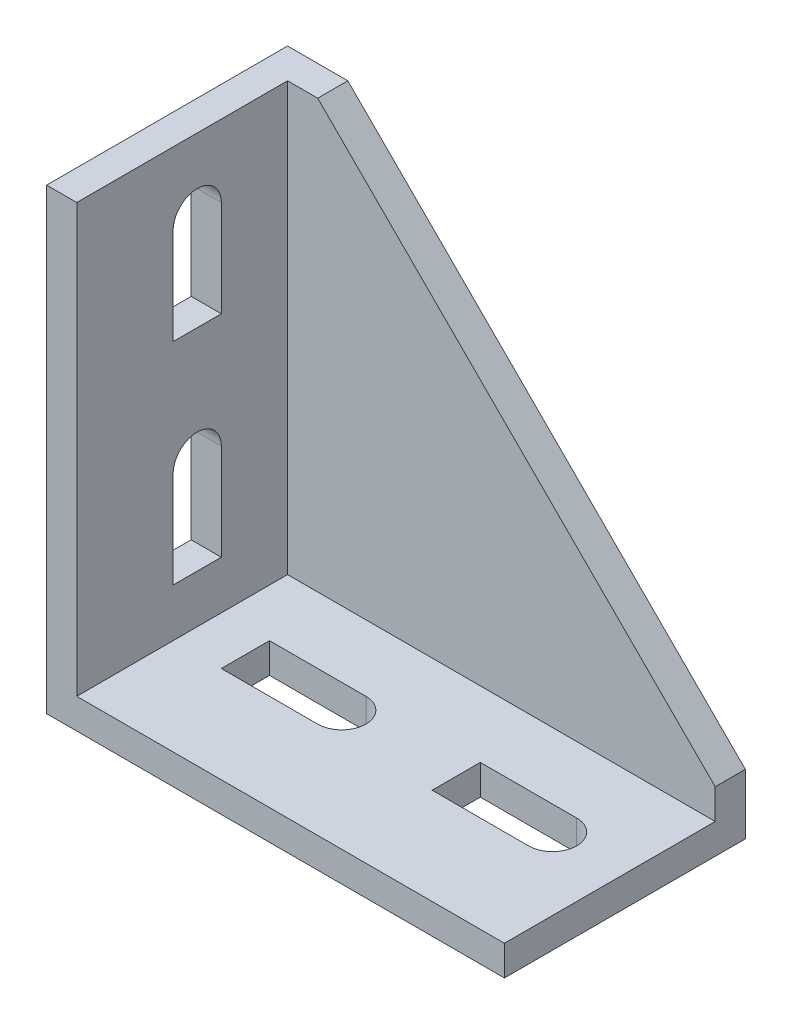
ISO-10303-21;
HEADER;
FILE_DESCRIPTION(('STEP AP214'),'2;1');
FILE_NAME('part.step','',(''),(''),'','','');
FILE_SCHEMA(('AUTOMOTIVE_DESIGN { 1 0 10303 214 1 1 1 1 }'));
ENDSEC;
DATA;
#1=APPLICATION_CONTEXT('core data for automotive mechanical design processes');
#2=APPLICATION_PROTOCOL_DEFINITION('international standard','automotive_design',2000,#1);
#3=PRODUCT_CONTEXT('',#1,'mechanical');
#4=PRODUCT('Part','Part','',(#3));
#5=PRODUCT_RELATED_PRODUCT_CATEGORY('part','',(#4));
#6=PRODUCT_DEFINITION_FORMATION('','',#4);
#7=PRODUCT_DEFINITION_CONTEXT('part definition',#1,'design');
#8=PRODUCT_DEFINITION('design','',#6,#7);
#9=PRODUCT_DEFINITION_SHAPE('','',#8);
#10=(LENGTH_UNIT() NAMED_UNIT(*) SI_UNIT(.MILLI.,.METRE.));
#11=(NAMED_UNIT(*) PLANE_ANGLE_UNIT() SI_UNIT($,.RADIAN.));
#12=(NAMED_UNIT(*) SI_UNIT($,.STERADIAN.) SOLID_ANGLE_UNIT());
#13=UNCERTAINTY_MEASURE_WITH_UNIT(LENGTH_MEASURE(1.E-05),#10,'distance_accuracy_value','');
#14=(GEOMETRIC_REPRESENTATION_CONTEXT(3) GLOBAL_UNCERTAINTY_ASSIGNED_CONTEXT((#13)) GLOBAL_UNIT_ASSIGNED_CONTEXT((#10,
#11,#12)) REPRESENTATION_CONTEXT('',''));
#15=CARTESIAN_POINT('',(0.,0.,0.));
#16=DIRECTION('',(0.,0.,1.));
#17=DIRECTION('',(1.,0.,0.));
#18=AXIS2_PLACEMENT_3D('',#15,#16,#17);
#19=CARTESIAN_POINT('',(76.,10.,40.));
#20=DIRECTION('',(-0.707106781186548,-0.707106781186548,0.));
#21=DIRECTION('',(0.707106781186548,-0.707106781186548,0.));
#22=AXIS2_PLACEMENT_3D('',#19,#20,#21);
#23=PLANE('',#22);
#24=DIRECTION('',(-0.707106781186548,0.707106781186548,0.));
#25=VECTOR('',#24,1.);
#26=CARTESIAN_POINT('',(76.,10.,5.));
#27=LINE('',#26,#25);
#28=CARTESIAN_POINT('',(76.,10.,5.));
#29=VERTEX_POINT('',#28);
#30=CARTESIAN_POINT('',(9.99999999999995,76.,5.));
#31=VERTEX_POINT('',#30);
#32=EDGE_CURVE('E349',#29,#31,#27,.T.);
#33=ORIENTED_EDGE('',*,*,#32,.F.);
#34=DIRECTION('',(0.,0.,-1.));
#35=VECTOR('',#34,1.);
#36=CARTESIAN_POINT('',(76.,10.,40.));
#37=LINE('',#36,#35);
#38=CARTESIAN_POINT('',(76.,10.,0.));
#39=VERTEX_POINT('',#38);
#40=EDGE_CURVE('E338',#29,#39,#37,.T.);
#41=ORIENTED_EDGE('',*,*,#40,.T.);
#42=DIRECTION('',(-0.707106781186547,0.707106781186547,0.));
#43=VECTOR('',#42,1.);
#44=CARTESIAN_POINT('',(76.,10.,0.));
#45=LINE('',#44,#43);
#46=CARTESIAN_POINT('',(10.,76.,0.));
#47=VERTEX_POINT('',#46);
#48=EDGE_CURVE('E318',#39,#47,#45,.T.);
#49=ORIENTED_EDGE('',*,*,#48,.T.);
#50=DIRECTION('',(0.,0.,-1.));
#51=VECTOR('',#50,1.);
#52=CARTESIAN_POINT('',(10.,76.,40.));
#53=LINE('',#52,#51);
#54=EDGE_CURVE('E325',#31,#47,#53,.T.);
#55=ORIENTED_EDGE('',*,*,#54,.F.);
#56=EDGE_LOOP('',(#33,#41,#49,#55));
#57=FACE_BOUND('',#56,.T.);
#58=ADVANCED_FACE('F35',(#57),#23,.F.);
#59=CARTESIAN_POINT('',(10.,76.,40.));
#60=DIRECTION('',(0.,-1.,0.));
#61=DIRECTION('',(0.,0.,-1.));
#62=AXIS2_PLACEMENT_3D('',#59,#60,#61);
#63=PLANE('',#62);
#64=DIRECTION('',(-1.,0.,0.));
#65=VECTOR('',#64,1.);
#66=CARTESIAN_POINT('',(10.,76.,40.));
#67=LINE('',#66,#65);
#68=CARTESIAN_POINT('',(5.,76.,40.));
#69=VERTEX_POINT('',#68);
#70=CARTESIAN_POINT('',(0.,76.,40.));
#71=VERTEX_POINT('',#70);
#72=EDGE_CURVE('E315',#69,#71,#67,.T.);
#73=ORIENTED_EDGE('',*,*,#72,.F.);
#74=DIRECTION('',(0.,0.,1.));
#75=VECTOR('',#74,1.);
#76=CARTESIAN_POINT('',(5.,76.,-100.40916292849));
#77=LINE('',#76,#75);
#78=CARTESIAN_POINT('',(5.,76.,5.));
#79=VERTEX_POINT('',#78);
#80=EDGE_CURVE('E306',#79,#69,#77,.T.);
#81=ORIENTED_EDGE('',*,*,#80,.F.);
#82=DIRECTION('',(1.,0.,0.));
#83=VECTOR('',#82,1.);
#84=CARTESIAN_POINT('',(5.,76.,5.));
#85=LINE('',#84,#83);
#86=EDGE_CURVE('E301',#79,#31,#85,.T.);
#87=ORIENTED_EDGE('',*,*,#86,.T.);
#88=ORIENTED_EDGE('',*,*,#54,.T.);
#89=DIRECTION('',(-1.,0.,0.));
#90=VECTOR('',#89,1.);
#91=CARTESIAN_POINT('',(10.,76.,0.));
#92=LINE('',#91,#90);
#93=CARTESIAN_POINT('',(0.,76.,0.));
#94=VERTEX_POINT('',#93);
#95=EDGE_CURVE('E314',#47,#94,#92,.T.);
#96=ORIENTED_EDGE('',*,*,#95,.T.);
#97=DIRECTION('',(0.,0.,-1.));
#98=VECTOR('',#97,1.);
#99=CARTESIAN_POINT('',(0.,76.,40.));
#100=LINE('',#99,#98);
#101=EDGE_CURVE('E346',#71,#94,#100,.T.);
#102=ORIENTED_EDGE('',*,*,#101,.F.);
#103=EDGE_LOOP('',(#73,#81,#87,#88,#96,#102));
#104=FACE_BOUND('',#103,.T.);
#105=ADVANCED_FACE('F487',(#104),#63,.F.);
#106=CARTESIAN_POINT('',(0.,76.,40.));
#107=DIRECTION('',(1.,0.,0.));
#108=DIRECTION('',(0.,0.,-1.));
#109=AXIS2_PLACEMENT_3D('',#106,#107,#108);
#110=PLANE('',#109);
#111=DIRECTION('',(0.,1.,0.));
#112=VECTOR('',#111,1.);
#113=CARTESIAN_POINT('',(0.,76.,16.));
#114=LINE('',#113,#112);
#115=CARTESIAN_POINT('',(0.,48.,16.));
#116=VERTEX_POINT('',#115);
#117=CARTESIAN_POINT('',(0.,64.,16.));
#118=VERTEX_POINT('',#117);
#119=EDGE_CURVE('E221',#116,#118,#114,.T.);
#120=ORIENTED_EDGE('',*,*,#119,.T.);
#121=CARTESIAN_POINT('',(0.,64.,20.));
#122=DIRECTION('',(1.,0.,0.));
#123=DIRECTION('',(0.,0.,-1.));
#124=AXIS2_PLACEMENT_3D('',#121,#122,#123);
#125=CIRCLE('',#124,4.);
#126=CARTESIAN_POINT('',(0.,68.,20.));
#127=VERTEX_POINT('',#126);
#128=EDGE_CURVE('E411',#118,#127,#125,.T.);
#129=ORIENTED_EDGE('',*,*,#128,.T.);
#130=CARTESIAN_POINT('',(0.,64.,20.));
#131=DIRECTION('',(1.,0.,0.));
#132=DIRECTION('',(0.,0.,-1.));
#133=AXIS2_PLACEMENT_3D('',#130,#131,#132);
#134=CIRCLE('',#133,4.);
#135=CARTESIAN_POINT('',(0.,64.,24.));
#136=VERTEX_POINT('',#135);
#137=EDGE_CURVE('E407',#127,#136,#134,.T.);
#138=ORIENTED_EDGE('',*,*,#137,.T.);
#139=DIRECTION('',(0.,-1.,0.));
#140=VECTOR('',#139,1.);
#141=CARTESIAN_POINT('',(0.,76.,24.));
#142=LINE('',#141,#140);
#143=CARTESIAN_POINT('',(0.,48.,24.));
#144=VERTEX_POINT('',#143);
#145=EDGE_CURVE('E247',#136,#144,#142,.T.);
#146=ORIENTED_EDGE('',*,*,#145,.T.);
#147=DIRECTION('',(0.,0.,-1.));
#148=VECTOR('',#147,1.);
#149=CARTESIAN_POINT('',(0.,48.,40.));
#150=LINE('',#149,#148);
#151=EDGE_CURVE('E232',#144,#116,#150,.T.);
#152=ORIENTED_EDGE('',*,*,#151,.T.);
#153=EDGE_LOOP('',(#120,#129,#138,#146,#152));
#154=FACE_BOUND('',#153,.T.);
#155=DIRECTION('',(0.,1.,0.));
#156=VECTOR('',#155,1.);
#157=CARTESIAN_POINT('',(0.,76.,16.));
#158=LINE('',#157,#156);
#159=CARTESIAN_POINT('',(0.,13.,16.));
#160=VERTEX_POINT('',#159);
#161=CARTESIAN_POINT('',(0.,29.,16.));
#162=VERTEX_POINT('',#161);
#163=EDGE_CURVE('E255',#160,#162,#158,.T.);
#164=ORIENTED_EDGE('',*,*,#163,.T.);
#165=CARTESIAN_POINT('',(0.,29.,20.));
#166=DIRECTION('',(1.,0.,0.));
#167=DIRECTION('',(0.,0.,-1.));
#168=AXIS2_PLACEMENT_3D('',#165,#166,#167);
#169=CIRCLE('',#168,4.);
#170=CARTESIAN_POINT('',(0.,33.,20.));
#171=VERTEX_POINT('',#170);
#172=EDGE_CURVE('E403',#162,#171,#169,.T.);
#173=ORIENTED_EDGE('',*,*,#172,.T.);
#174=CARTESIAN_POINT('',(0.,29.,20.));
#175=DIRECTION('',(1.,0.,0.));
#176=DIRECTION('',(0.,0.,-1.));
#177=AXIS2_PLACEMENT_3D('',#174,#175,#176);
#178=CIRCLE('',#177,4.);
#179=CARTESIAN_POINT('',(0.,29.,24.));
#180=VERTEX_POINT('',#179);
#181=EDGE_CURVE('E399',#171,#180,#178,.T.);
#182=ORIENTED_EDGE('',*,*,#181,.T.);
#183=DIRECTION('',(0.,-1.,0.));
#184=VECTOR('',#183,1.);
#185=CARTESIAN_POINT('',(0.,76.,24.));
#186=LINE('',#185,#184);
#187=CARTESIAN_POINT('',(0.,13.,24.));
#188=VERTEX_POINT('',#187);
#189=EDGE_CURVE('E263',#180,#188,#186,.T.);
#190=ORIENTED_EDGE('',*,*,#189,.T.);
#191=DIRECTION('',(0.,0.,-1.));
#192=VECTOR('',#191,1.);
#193=CARTESIAN_POINT('',(0.,13.,39.9999999999999));
#194=LINE('',#193,#192);
#195=EDGE_CURVE('E260',#188,#160,#194,.T.);
#196=ORIENTED_EDGE('',*,*,#195,.T.);
#197=EDGE_LOOP('',(#164,#173,#182,#190,#196));
#198=FACE_BOUND('',#197,.T.);
#199=DIRECTION('',(0.,-1.,0.));
#200=VECTOR('',#199,1.);
#201=CARTESIAN_POINT('',(0.,76.,0.));
#202=LINE('',#201,#200);
#203=CARTESIAN_POINT('',(0.,0.,0.));
#204=VERTEX_POINT('',#203);
#205=EDGE_CURVE('E328',#94,#204,#202,.T.);
#206=ORIENTED_EDGE('',*,*,#205,.T.);
#207=DIRECTION('',(0.,0.,-1.));
#208=VECTOR('',#207,1.);
#209=CARTESIAN_POINT('',(0.,0.,40.));
#210=LINE('',#209,#208);
#211=CARTESIAN_POINT('',(0.,0.,40.));
#212=VERTEX_POINT('',#211);
#213=EDGE_CURVE('E343',#212,#204,#210,.T.);
#214=ORIENTED_EDGE('',*,*,#213,.F.);
#215=DIRECTION('',(0.,-1.,0.));
#216=VECTOR('',#215,1.);
#217=CARTESIAN_POINT('',(0.,76.,40.));
#218=LINE('',#217,#216);
#219=EDGE_CURVE('E317',#71,#212,#218,.T.);
#220=ORIENTED_EDGE('',*,*,#219,.F.);
#221=ORIENTED_EDGE('',*,*,#101,.T.);
#222=EDGE_LOOP('',(#206,#214,#220,#221));
#223=FACE_BOUND('',#222,.T.);
#224=ADVANCED_FACE('F244',(#154,#198,#223),#110,.F.);
#225=CARTESIAN_POINT('',(0.,0.,40.));
#226=DIRECTION('',(0.,1.,0.));
#227=DIRECTION('',(0.,0.,1.));
#228=AXIS2_PLACEMENT_3D('',#225,#226,#227);
#229=PLANE('',#228);
#230=DIRECTION('',(1.,0.,0.));
#231=VECTOR('',#230,1.);
#232=CARTESIAN_POINT('',(0.,0.,24.));
#233=LINE('',#232,#231);
#234=CARTESIAN_POINT('',(48.,0.,24.));
#235=VERTEX_POINT('',#234);
#236=CARTESIAN_POINT('',(64.,0.,24.));
#237=VERTEX_POINT('',#236);
#238=EDGE_CURVE('E276',#235,#237,#233,.T.);
#239=ORIENTED_EDGE('',*,*,#238,.T.);
#240=CARTESIAN_POINT('',(64.,0.,20.));
#241=DIRECTION('',(0.,1.,0.));
#242=DIRECTION('',(0.,0.,1.));
#243=AXIS2_PLACEMENT_3D('',#240,#241,#242);
#244=CIRCLE('',#243,4.);
#245=CARTESIAN_POINT('',(68.,0.,20.));
#246=VERTEX_POINT('',#245);
#247=EDGE_CURVE('E51',#237,#246,#244,.T.);
#248=ORIENTED_EDGE('',*,*,#247,.T.);
#249=CARTESIAN_POINT('',(64.,0.,20.));
#250=DIRECTION('',(0.,1.,0.));
#251=DIRECTION('',(0.,0.,1.));
#252=AXIS2_PLACEMENT_3D('',#249,#250,#251);
#253=CIRCLE('',#252,4.);
#254=CARTESIAN_POINT('',(64.,0.,16.));
#255=VERTEX_POINT('',#254);
#256=EDGE_CURVE('E12',#246,#255,#253,.T.);
#257=ORIENTED_EDGE('',*,*,#256,.T.);
#258=DIRECTION('',(-1.,0.,0.));
#259=VECTOR('',#258,1.);
#260=CARTESIAN_POINT('',(0.,0.,16.));
#261=LINE('',#260,#259);
#262=CARTESIAN_POINT('',(48.,0.,16.));
#263=VERTEX_POINT('',#262);
#264=EDGE_CURVE('E269',#255,#263,#261,.T.);
#265=ORIENTED_EDGE('',*,*,#264,.T.);
#266=DIRECTION('',(0.,0.,1.));
#267=VECTOR('',#266,1.);
#268=CARTESIAN_POINT('',(48.,0.,39.9999999999999));
#269=LINE('',#268,#267);
#270=EDGE_CURVE('E273',#263,#235,#269,.T.);
#271=ORIENTED_EDGE('',*,*,#270,.T.);
#272=EDGE_LOOP('',(#239,#248,#257,#265,#271));
#273=FACE_BOUND('',#272,.T.);
#274=DIRECTION('',(1.,0.,0.));
#275=VECTOR('',#274,1.);
#276=CARTESIAN_POINT('',(0.,0.,24.));
#277=LINE('',#276,#275);
#278=CARTESIAN_POINT('',(13.,0.,24.));
#279=VERTEX_POINT('',#278);
#280=CARTESIAN_POINT('',(29.,0.,24.));
#281=VERTEX_POINT('',#280);
#282=EDGE_CURVE('E289',#279,#281,#277,.T.);
#283=ORIENTED_EDGE('',*,*,#282,.T.);
#284=CARTESIAN_POINT('',(29.,0.,20.));
#285=DIRECTION('',(0.,1.,0.));
#286=DIRECTION('',(0.,0.,1.));
#287=AXIS2_PLACEMENT_3D('',#284,#285,#286);
#288=CIRCLE('',#287,4.);
#289=CARTESIAN_POINT('',(33.,0.,20.));
#290=VERTEX_POINT('',#289);
#291=EDGE_CURVE('E417',#281,#290,#288,.T.);
#292=ORIENTED_EDGE('',*,*,#291,.T.);
#293=CARTESIAN_POINT('',(29.,0.,20.));
#294=DIRECTION('',(0.,1.,0.));
#295=DIRECTION('',(0.,0.,1.));
#296=AXIS2_PLACEMENT_3D('',#293,#294,#295);
#297=CIRCLE('',#296,4.);
#298=CARTESIAN_POINT('',(29.,0.,16.));
#299=VERTEX_POINT('',#298);
#300=EDGE_CURVE('E421',#290,#299,#297,.T.);
#301=ORIENTED_EDGE('',*,*,#300,.T.);
#302=DIRECTION('',(-1.,0.,0.));
#303=VECTOR('',#302,1.);
#304=CARTESIAN_POINT('',(0.,0.,16.));
#305=LINE('',#304,#303);
#306=CARTESIAN_POINT('',(13.,0.,16.));
#307=VERTEX_POINT('',#306);
#308=EDGE_CURVE('E282',#299,#307,#305,.T.);
#309=ORIENTED_EDGE('',*,*,#308,.T.);
#310=DIRECTION('',(0.,0.,1.));
#311=VECTOR('',#310,1.);
#312=CARTESIAN_POINT('',(13.,0.,40.));
#313=LINE('',#312,#311);
#314=EDGE_CURVE('E286',#307,#279,#313,.T.);
#315=ORIENTED_EDGE('',*,*,#314,.T.);
#316=EDGE_LOOP('',(#283,#292,#301,#309,#315));
#317=FACE_BOUND('',#316,.T.);
#318=DIRECTION('',(1.,0.,0.));
#319=VECTOR('',#318,1.);
#320=CARTESIAN_POINT('',(0.,0.,0.));
#321=LINE('',#320,#319);
#322=CARTESIAN_POINT('',(76.,0.,0.));
#323=VERTEX_POINT('',#322);
#324=EDGE_CURVE('E330',#204,#323,#321,.T.);
#325=ORIENTED_EDGE('',*,*,#324,.T.);
#326=DIRECTION('',(0.,0.,-1.));
#327=VECTOR('',#326,1.);
#328=CARTESIAN_POINT('',(76.,0.,40.));
#329=LINE('',#328,#327);
#330=CARTESIAN_POINT('',(76.,0.,40.));
#331=VERTEX_POINT('',#330);
#332=EDGE_CURVE('E340',#331,#323,#329,.T.);
#333=ORIENTED_EDGE('',*,*,#332,.F.);
#334=DIRECTION('',(1.,0.,0.));
#335=VECTOR('',#334,1.);
#336=CARTESIAN_POINT('',(0.,0.,40.));
#337=LINE('',#336,#335);
#338=EDGE_CURVE('E320',#212,#331,#337,.T.);
#339=ORIENTED_EDGE('',*,*,#338,.F.);
#340=ORIENTED_EDGE('',*,*,#213,.T.);
#341=EDGE_LOOP('',(#325,#333,#339,#340));
#342=FACE_BOUND('',#341,.T.);
#343=ADVANCED_FACE('F444',(#273,#317,#342),#229,.F.);
#344=CARTESIAN_POINT('',(76.,0.,40.));
#345=DIRECTION('',(-1.,0.,0.));
#346=DIRECTION('',(0.,0.,1.));
#347=AXIS2_PLACEMENT_3D('',#344,#345,#346);
#348=PLANE('',#347);
#349=DIRECTION('',(0.,-1.,0.));
#350=VECTOR('',#349,1.);
#351=CARTESIAN_POINT('',(76.,76.,5.));
#352=LINE('',#351,#350);
#353=CARTESIAN_POINT('',(76.,5.,5.));
#354=VERTEX_POINT('',#353);
#355=EDGE_CURVE('E298',#29,#354,#352,.T.);
#356=ORIENTED_EDGE('',*,*,#355,.T.);
#357=DIRECTION('',(0.,0.,1.));
#358=VECTOR('',#357,1.);
#359=CARTESIAN_POINT('',(76.,5.,-100.40916292849));
#360=LINE('',#359,#358);
#361=CARTESIAN_POINT('',(76.,5.,40.));
#362=VERTEX_POINT('',#361);
#363=EDGE_CURVE('E296',#354,#362,#360,.T.);
#364=ORIENTED_EDGE('',*,*,#363,.T.);
#365=DIRECTION('',(0.,1.,0.));
#366=VECTOR('',#365,1.);
#367=CARTESIAN_POINT('',(76.,0.,40.));
#368=LINE('',#367,#366);
#369=EDGE_CURVE('E322',#331,#362,#368,.T.);
#370=ORIENTED_EDGE('',*,*,#369,.F.);
#371=ORIENTED_EDGE('',*,*,#332,.T.);
#372=DIRECTION('',(0.,1.,0.));
#373=VECTOR('',#372,1.);
#374=CARTESIAN_POINT('',(76.,0.,0.));
#375=LINE('',#374,#373);
#376=EDGE_CURVE('E332',#323,#39,#375,.T.);
#377=ORIENTED_EDGE('',*,*,#376,.T.);
#378=ORIENTED_EDGE('',*,*,#40,.F.);
#379=EDGE_LOOP('',(#356,#364,#370,#371,#377,#378));
#380=FACE_BOUND('',#379,.T.);
#381=ADVANCED_FACE('F479',(#380),#348,.F.);
#382=CARTESIAN_POINT('',(0.,0.,40.));
#383=DIRECTION('',(0.,0.,1.));
#384=DIRECTION('',(1.,0.,0.));
#385=AXIS2_PLACEMENT_3D('',#382,#383,#384);
#386=PLANE('',#385);
#387=DIRECTION('',(1.,0.,0.));
#388=VECTOR('',#387,1.);
#389=CARTESIAN_POINT('',(5.,5.,40.));
#390=LINE('',#389,#388);
#391=CARTESIAN_POINT('',(5.,5.,40.));
#392=VERTEX_POINT('',#391);
#393=EDGE_CURVE('E304',#392,#362,#390,.T.);
#394=ORIENTED_EDGE('',*,*,#393,.F.);
#395=DIRECTION('',(0.,-1.,0.));
#396=VECTOR('',#395,1.);
#397=CARTESIAN_POINT('',(5.,76.,40.));
#398=LINE('',#397,#396);
#399=EDGE_CURVE('E292',#69,#392,#398,.T.);
#400=ORIENTED_EDGE('',*,*,#399,.F.);
#401=ORIENTED_EDGE('',*,*,#72,.T.);
#402=ORIENTED_EDGE('',*,*,#219,.T.);
#403=ORIENTED_EDGE('',*,*,#338,.T.);
#404=ORIENTED_EDGE('',*,*,#369,.T.);
#405=EDGE_LOOP('',(#394,#400,#401,#402,#403,#404));
#406=FACE_BOUND('',#405,.T.);
#407=ADVANCED_FACE('F476',(#406),#386,.T.);
#408=CARTESIAN_POINT('',(0.,0.,0.));
#409=DIRECTION('',(0.,0.,1.));
#410=DIRECTION('',(1.,0.,0.));
#411=AXIS2_PLACEMENT_3D('',#408,#409,#410);
#412=PLANE('',#411);
#413=ORIENTED_EDGE('',*,*,#95,.F.);
#414=ORIENTED_EDGE('',*,*,#48,.F.);
#415=ORIENTED_EDGE('',*,*,#376,.F.);
#416=ORIENTED_EDGE('',*,*,#324,.F.);
#417=ORIENTED_EDGE('',*,*,#205,.F.);
#418=EDGE_LOOP('',(#413,#414,#415,#416,#417));
#419=FACE_BOUND('',#418,.T.);
#420=ADVANCED_FACE('F498',(#419),#412,.F.);
#421=CARTESIAN_POINT('',(0.,0.,5.));
#422=DIRECTION('',(0.,0.,1.));
#423=DIRECTION('',(1.,0.,0.));
#424=AXIS2_PLACEMENT_3D('',#421,#422,#423);
#425=PLANE('',#424);
#426=ORIENTED_EDGE('',*,*,#32,.T.);
#427=ORIENTED_EDGE('',*,*,#86,.F.);
#428=DIRECTION('',(0.,1.,0.));
#429=VECTOR('',#428,1.);
#430=CARTESIAN_POINT('',(5.,76.,5.));
#431=LINE('',#430,#429);
#432=CARTESIAN_POINT('',(5.,5.,5.));
#433=VERTEX_POINT('',#432);
#434=EDGE_CURVE('E293',#433,#79,#431,.T.);
#435=ORIENTED_EDGE('',*,*,#434,.F.);
#436=DIRECTION('',(-1.,0.,0.));
#437=VECTOR('',#436,1.);
#438=CARTESIAN_POINT('',(5.,5.,5.));
#439=LINE('',#438,#437);
#440=EDGE_CURVE('E295',#354,#433,#439,.T.);
#441=ORIENTED_EDGE('',*,*,#440,.F.);
#442=ORIENTED_EDGE('',*,*,#355,.F.);
#443=EDGE_LOOP('',(#426,#427,#435,#441,#442));
#444=FACE_BOUND('',#443,.T.);
#445=ADVANCED_FACE('F461',(#444),#425,.T.);
#446=CARTESIAN_POINT('',(5.,5.,-100.40916292849));
#447=DIRECTION('',(0.,-1.,0.));
#448=DIRECTION('',(1.,0.,0.));
#449=AXIS2_PLACEMENT_3D('',#446,#447,#448);
#450=PLANE('',#449);
#451=DIRECTION('',(1.,0.,0.));
#452=VECTOR('',#451,1.);
#453=CARTESIAN_POINT('',(5.,5.,16.));
#454=LINE('',#453,#452);
#455=CARTESIAN_POINT('',(48.,4.99999999999999,16.));
#456=VERTEX_POINT('',#455);
#457=CARTESIAN_POINT('',(64.,5.,16.));
#458=VERTEX_POINT('',#457);
#459=EDGE_CURVE('E359',#456,#458,#454,.T.);
#460=ORIENTED_EDGE('',*,*,#459,.T.);
#461=CARTESIAN_POINT('',(64.,5.,20.));
#462=DIRECTION('',(0.,-1.,0.));
#463=DIRECTION('',(1.,0.,0.));
#464=AXIS2_PLACEMENT_3D('',#461,#462,#463);
#465=CIRCLE('',#464,4.);
#466=CARTESIAN_POINT('',(68.,5.,20.));
#467=VERTEX_POINT('',#466);
#468=EDGE_CURVE('E44',#458,#467,#465,.T.);
#469=ORIENTED_EDGE('',*,*,#468,.T.);
#470=CARTESIAN_POINT('',(64.,5.,20.));
#471=DIRECTION('',(0.,-1.,0.));
#472=DIRECTION('',(1.,0.,0.));
#473=AXIS2_PLACEMENT_3D('',#470,#471,#472);
#474=CIRCLE('',#473,4.);
#475=CARTESIAN_POINT('',(64.,5.,24.));
#476=VERTEX_POINT('',#475);
#477=EDGE_CURVE('E423',#467,#476,#474,.T.);
#478=ORIENTED_EDGE('',*,*,#477,.T.);
#479=DIRECTION('',(-1.,0.,0.));
#480=VECTOR('',#479,1.);
#481=CARTESIAN_POINT('',(5.,5.,24.));
#482=LINE('',#481,#480);
#483=CARTESIAN_POINT('',(48.,4.99999999999999,24.));
#484=VERTEX_POINT('',#483);
#485=EDGE_CURVE('E364',#476,#484,#482,.T.);
#486=ORIENTED_EDGE('',*,*,#485,.T.);
#487=DIRECTION('',(0.,0.,-1.));
#488=VECTOR('',#487,1.);
#489=CARTESIAN_POINT('',(47.9999999999998,5.,-100.40916292849));
#490=LINE('',#489,#488);
#491=EDGE_CURVE('E361',#484,#456,#490,.T.);
#492=ORIENTED_EDGE('',*,*,#491,.T.);
#493=EDGE_LOOP('',(#460,#469,#478,#486,#492));
#494=FACE_BOUND('',#493,.T.);
#495=DIRECTION('',(1.,0.,0.));
#496=VECTOR('',#495,1.);
#497=CARTESIAN_POINT('',(5.,5.,16.));
#498=LINE('',#497,#496);
#499=CARTESIAN_POINT('',(13.,5.,16.));
#500=VERTEX_POINT('',#499);
#501=CARTESIAN_POINT('',(29.,5.,16.));
#502=VERTEX_POINT('',#501);
#503=EDGE_CURVE('E351',#500,#502,#498,.T.);
#504=ORIENTED_EDGE('',*,*,#503,.T.);
#505=CARTESIAN_POINT('',(29.,5.,20.));
#506=DIRECTION('',(0.,-1.,0.));
#507=DIRECTION('',(1.,0.,0.));
#508=AXIS2_PLACEMENT_3D('',#505,#506,#507);
#509=CIRCLE('',#508,4.);
#510=CARTESIAN_POINT('',(33.,5.,20.));
#511=VERTEX_POINT('',#510);
#512=EDGE_CURVE('E419',#502,#511,#509,.T.);
#513=ORIENTED_EDGE('',*,*,#512,.T.);
#514=CARTESIAN_POINT('',(29.,5.,20.));
#515=DIRECTION('',(0.,-1.,0.));
#516=DIRECTION('',(1.,0.,0.));
#517=AXIS2_PLACEMENT_3D('',#514,#515,#516);
#518=CIRCLE('',#517,4.);
#519=CARTESIAN_POINT('',(29.,5.,24.));
#520=VERTEX_POINT('',#519);
#521=EDGE_CURVE('E415',#511,#520,#518,.T.);
#522=ORIENTED_EDGE('',*,*,#521,.T.);
#523=DIRECTION('',(-1.,0.,0.));
#524=VECTOR('',#523,1.);
#525=CARTESIAN_POINT('',(5.,5.,24.));
#526=LINE('',#525,#524);
#527=CARTESIAN_POINT('',(13.,5.,24.));
#528=VERTEX_POINT('',#527);
#529=EDGE_CURVE('E357',#520,#528,#526,.T.);
#530=ORIENTED_EDGE('',*,*,#529,.T.);
#531=DIRECTION('',(0.,0.,-1.));
#532=VECTOR('',#531,1.);
#533=CARTESIAN_POINT('',(13.0000000000001,5.,-100.40916292849));
#534=LINE('',#533,#532);
#535=EDGE_CURVE('E354',#528,#500,#534,.T.);
#536=ORIENTED_EDGE('',*,*,#535,.T.);
#537=EDGE_LOOP('',(#504,#513,#522,#530,#536));
#538=FACE_BOUND('',#537,.T.);
#539=ORIENTED_EDGE('',*,*,#440,.T.);
#540=DIRECTION('',(0.,0.,1.));
#541=VECTOR('',#540,1.);
#542=CARTESIAN_POINT('',(5.,5.,-100.40916292849));
#543=LINE('',#542,#541);
#544=EDGE_CURVE('E309',#433,#392,#543,.T.);
#545=ORIENTED_EDGE('',*,*,#544,.T.);
#546=ORIENTED_EDGE('',*,*,#393,.T.);
#547=ORIENTED_EDGE('',*,*,#363,.F.);
#548=EDGE_LOOP('',(#539,#545,#546,#547));
#549=FACE_BOUND('',#548,.T.);
#550=ADVANCED_FACE('F457',(#494,#538,#549),#450,.F.);
#551=CARTESIAN_POINT('',(5.,76.,-100.40916292849));
#552=DIRECTION('',(-1.,0.,0.));
#553=DIRECTION('',(0.,0.,1.));
#554=AXIS2_PLACEMENT_3D('',#551,#552,#553);
#555=PLANE('',#554);
#556=DIRECTION('',(0.,1.,0.));
#557=VECTOR('',#556,1.);
#558=CARTESIAN_POINT('',(5.,76.,24.));
#559=LINE('',#558,#557);
#560=CARTESIAN_POINT('',(5.,48.,24.));
#561=VERTEX_POINT('',#560);
#562=CARTESIAN_POINT('',(5.,64.,24.));
#563=VERTEX_POINT('',#562);
#564=EDGE_CURVE('E377',#561,#563,#559,.T.);
#565=ORIENTED_EDGE('',*,*,#564,.T.);
#566=CARTESIAN_POINT('',(5.,64.,20.));
#567=DIRECTION('',(-1.,0.,0.));
#568=DIRECTION('',(0.,0.,1.));
#569=AXIS2_PLACEMENT_3D('',#566,#567,#568);
#570=CIRCLE('',#569,4.);
#571=CARTESIAN_POINT('',(5.,68.,20.));
#572=VERTEX_POINT('',#571);
#573=EDGE_CURVE('E409',#563,#572,#570,.T.);
#574=ORIENTED_EDGE('',*,*,#573,.T.);
#575=CARTESIAN_POINT('',(5.,64.,20.));
#576=DIRECTION('',(-1.,0.,0.));
#577=DIRECTION('',(0.,0.,1.));
#578=AXIS2_PLACEMENT_3D('',#575,#576,#577);
#579=CIRCLE('',#578,4.);
#580=CARTESIAN_POINT('',(5.,64.,16.));
#581=VERTEX_POINT('',#580);
#582=EDGE_CURVE('E413',#572,#581,#579,.T.);
#583=ORIENTED_EDGE('',*,*,#582,.T.);
#584=DIRECTION('',(0.,-1.,0.));
#585=VECTOR('',#584,1.);
#586=CARTESIAN_POINT('',(5.,76.,16.));
#587=LINE('',#586,#585);
#588=CARTESIAN_POINT('',(5.,47.9999999999999,16.));
#589=VERTEX_POINT('',#588);
#590=EDGE_CURVE('E374',#581,#589,#587,.T.);
#591=ORIENTED_EDGE('',*,*,#590,.T.);
#592=DIRECTION('',(0.,0.,1.));
#593=VECTOR('',#592,1.);
#594=CARTESIAN_POINT('',(5.,47.9999999999998,-100.40916292849));
#595=LINE('',#594,#593);
#596=EDGE_CURVE('E241',#589,#561,#595,.T.);
#597=ORIENTED_EDGE('',*,*,#596,.T.);
#598=EDGE_LOOP('',(#565,#574,#583,#591,#597));
#599=FACE_BOUND('',#598,.T.);
#600=DIRECTION('',(0.,1.,0.));
#601=VECTOR('',#600,1.);
#602=CARTESIAN_POINT('',(5.,76.,24.));
#603=LINE('',#602,#601);
#604=CARTESIAN_POINT('',(5.,13.,24.));
#605=VERTEX_POINT('',#604);
#606=CARTESIAN_POINT('',(5.,29.,24.));
#607=VERTEX_POINT('',#606);
#608=EDGE_CURVE('E371',#605,#607,#603,.T.);
#609=ORIENTED_EDGE('',*,*,#608,.T.);
#610=CARTESIAN_POINT('',(5.,29.,20.));
#611=DIRECTION('',(-1.,0.,0.));
#612=DIRECTION('',(0.,0.,1.));
#613=AXIS2_PLACEMENT_3D('',#610,#611,#612);
#614=CIRCLE('',#613,4.);
#615=CARTESIAN_POINT('',(5.,33.,20.));
#616=VERTEX_POINT('',#615);
#617=EDGE_CURVE('E401',#607,#616,#614,.T.);
#618=ORIENTED_EDGE('',*,*,#617,.T.);
#619=CARTESIAN_POINT('',(5.,29.,20.));
#620=DIRECTION('',(-1.,0.,0.));
#621=DIRECTION('',(0.,0.,1.));
#622=AXIS2_PLACEMENT_3D('',#619,#620,#621);
#623=CIRCLE('',#622,4.);
#624=CARTESIAN_POINT('',(5.,29.,16.));
#625=VERTEX_POINT('',#624);
#626=EDGE_CURVE('E405',#616,#625,#623,.T.);
#627=ORIENTED_EDGE('',*,*,#626,.T.);
#628=DIRECTION('',(0.,-1.,0.));
#629=VECTOR('',#628,1.);
#630=CARTESIAN_POINT('',(5.,76.,16.));
#631=LINE('',#630,#629);
#632=CARTESIAN_POINT('',(5.,12.9999999999999,16.));
#633=VERTEX_POINT('',#632);
#634=EDGE_CURVE('E366',#625,#633,#631,.T.);
#635=ORIENTED_EDGE('',*,*,#634,.T.);
#636=DIRECTION('',(0.,0.,1.));
#637=VECTOR('',#636,1.);
#638=CARTESIAN_POINT('',(5.,13.0000000000001,-100.40916292849));
#639=LINE('',#638,#637);
#640=EDGE_CURVE('E368',#633,#605,#639,.T.);
#641=ORIENTED_EDGE('',*,*,#640,.T.);
#642=EDGE_LOOP('',(#609,#618,#627,#635,#641));
#643=FACE_BOUND('',#642,.T.);
#644=ORIENTED_EDGE('',*,*,#434,.T.);
#645=ORIENTED_EDGE('',*,*,#80,.T.);
#646=ORIENTED_EDGE('',*,*,#399,.T.);
#647=ORIENTED_EDGE('',*,*,#544,.F.);
#648=EDGE_LOOP('',(#644,#645,#646,#647));
#649=FACE_BOUND('',#648,.T.);
#650=ADVANCED_FACE('F460',(#599,#643,#649),#555,.F.);
#651=CARTESIAN_POINT('',(13.,-17.5,24.));
#652=DIRECTION('',(0.,0.,1.));
#653=DIRECTION('',(1.,0.,0.));
#654=AXIS2_PLACEMENT_3D('',#651,#652,#653);
#655=PLANE('',#654);
#656=ORIENTED_EDGE('',*,*,#529,.F.);
#657=DIRECTION('',(0.,1.,0.));
#658=VECTOR('',#657,1.);
#659=CARTESIAN_POINT('',(29.,0.,24.));
#660=LINE('',#659,#658);
#661=EDGE_CURVE('E389',#520,#281,#660,.F.);
#662=ORIENTED_EDGE('',*,*,#661,.T.);
#663=ORIENTED_EDGE('',*,*,#282,.F.);
#664=DIRECTION('',(0.,1.,0.));
#665=VECTOR('',#664,1.);
#666=CARTESIAN_POINT('',(13.,-17.5,24.));
#667=LINE('',#666,#665);
#668=EDGE_CURVE('E279',#279,#528,#667,.T.);
#669=ORIENTED_EDGE('',*,*,#668,.T.);
#670=EDGE_LOOP('',(#656,#662,#663,#669));
#671=FACE_BOUND('',#670,.T.);
#672=ADVANCED_FACE('F665',(#671),#655,.F.);
#673=CARTESIAN_POINT('',(13.,-17.5,16.));
#674=DIRECTION('',(-1.,0.,0.));
#675=DIRECTION('',(0.,0.,1.));
#676=AXIS2_PLACEMENT_3D('',#673,#674,#675);
#677=PLANE('',#676);
#678=DIRECTION('',(0.,1.,0.));
#679=VECTOR('',#678,1.);
#680=CARTESIAN_POINT('',(13.,-17.5,16.));
#681=LINE('',#680,#679);
#682=EDGE_CURVE('E278',#307,#500,#681,.T.);
#683=ORIENTED_EDGE('',*,*,#682,.T.);
#684=ORIENTED_EDGE('',*,*,#535,.F.);
#685=ORIENTED_EDGE('',*,*,#668,.F.);
#686=ORIENTED_EDGE('',*,*,#314,.F.);
#687=EDGE_LOOP('',(#683,#684,#685,#686));
#688=FACE_BOUND('',#687,.T.);
#689=ADVANCED_FACE('F655',(#688),#677,.F.);
#690=CARTESIAN_POINT('',(13.,-17.5,16.));
#691=DIRECTION('',(0.,0.,-1.));
#692=DIRECTION('',(-1.,0.,0.));
#693=AXIS2_PLACEMENT_3D('',#690,#691,#692);
#694=PLANE('',#693);
#695=ORIENTED_EDGE('',*,*,#308,.F.);
#696=DIRECTION('',(0.,1.,0.));
#697=VECTOR('',#696,1.);
#698=CARTESIAN_POINT('',(29.,5.,16.));
#699=LINE('',#698,#697);
#700=EDGE_CURVE('E392',#299,#502,#699,.T.);
#701=ORIENTED_EDGE('',*,*,#700,.T.);
#702=ORIENTED_EDGE('',*,*,#503,.F.);
#703=ORIENTED_EDGE('',*,*,#682,.F.);
#704=EDGE_LOOP('',(#695,#701,#702,#703));
#705=FACE_BOUND('',#704,.T.);
#706=ADVANCED_FACE('F646',(#705),#694,.F.);
#707=CARTESIAN_POINT('',(48.,-17.5,24.));
#708=DIRECTION('',(0.,0.,1.));
#709=DIRECTION('',(1.,0.,0.));
#710=AXIS2_PLACEMENT_3D('',#707,#708,#709);
#711=PLANE('',#710);
#712=ORIENTED_EDGE('',*,*,#485,.F.);
#713=DIRECTION('',(0.,1.,0.));
#714=VECTOR('',#713,1.);
#715=CARTESIAN_POINT('',(64.,0.,24.));
#716=LINE('',#715,#714);
#717=EDGE_CURVE('E394',#476,#237,#716,.F.);
#718=ORIENTED_EDGE('',*,*,#717,.T.);
#719=ORIENTED_EDGE('',*,*,#238,.F.);
#720=DIRECTION('',(0.,1.,0.));
#721=VECTOR('',#720,1.);
#722=CARTESIAN_POINT('',(48.,-17.5,24.));
#723=LINE('',#722,#721);
#724=EDGE_CURVE('E266',#235,#484,#723,.T.);
#725=ORIENTED_EDGE('',*,*,#724,.T.);
#726=EDGE_LOOP('',(#712,#718,#719,#725));
#727=FACE_BOUND('',#726,.T.);
#728=ADVANCED_FACE('F456',(#727),#711,.F.);
#729=CARTESIAN_POINT('',(48.,-17.5,16.));
#730=DIRECTION('',(-1.,0.,0.));
#731=DIRECTION('',(0.,0.,1.));
#732=AXIS2_PLACEMENT_3D('',#729,#730,#731);
#733=PLANE('',#732);
#734=DIRECTION('',(0.,1.,0.));
#735=VECTOR('',#734,1.);
#736=CARTESIAN_POINT('',(48.,-17.5,16.));
#737=LINE('',#736,#735);
#738=EDGE_CURVE('E265',#263,#456,#737,.T.);
#739=ORIENTED_EDGE('',*,*,#738,.T.);
#740=ORIENTED_EDGE('',*,*,#491,.F.);
#741=ORIENTED_EDGE('',*,*,#724,.F.);
#742=ORIENTED_EDGE('',*,*,#270,.F.);
#743=EDGE_LOOP('',(#739,#740,#741,#742));
#744=FACE_BOUND('',#743,.T.);
#745=ADVANCED_FACE('F453',(#744),#733,.F.);
#746=CARTESIAN_POINT('',(48.,-17.5,16.));
#747=DIRECTION('',(0.,0.,-1.));
#748=DIRECTION('',(-1.,0.,0.));
#749=AXIS2_PLACEMENT_3D('',#746,#747,#748);
#750=PLANE('',#749);
#751=ORIENTED_EDGE('',*,*,#264,.F.);
#752=DIRECTION('',(0.,1.,0.));
#753=VECTOR('',#752,1.);
#754=CARTESIAN_POINT('',(64.,5.,16.));
#755=LINE('',#754,#753);
#756=EDGE_CURVE('E397',#255,#458,#755,.T.);
#757=ORIENTED_EDGE('',*,*,#756,.T.);
#758=ORIENTED_EDGE('',*,*,#459,.F.);
#759=ORIENTED_EDGE('',*,*,#738,.F.);
#760=EDGE_LOOP('',(#751,#757,#758,#759));
#761=FACE_BOUND('',#760,.T.);
#762=ADVANCED_FACE('F448',(#761),#750,.F.);
#763=CARTESIAN_POINT('',(17.5,13.0000000000001,24.));
#764=DIRECTION('',(0.,0.,1.));
#765=DIRECTION('',(1.,0.,0.));
#766=AXIS2_PLACEMENT_3D('',#763,#764,#765);
#767=PLANE('',#766);
#768=ORIENTED_EDGE('',*,*,#189,.F.);
#769=DIRECTION('',(-1.,0.,0.));
#770=VECTOR('',#769,1.);
#771=CARTESIAN_POINT('',(5.00000000000002,29.,24.));
#772=LINE('',#771,#770);
#773=EDGE_CURVE('E380',#180,#607,#772,.F.);
#774=ORIENTED_EDGE('',*,*,#773,.T.);
#775=ORIENTED_EDGE('',*,*,#608,.F.);
#776=DIRECTION('',(-1.,0.,0.));
#777=VECTOR('',#776,1.);
#778=CARTESIAN_POINT('',(17.5,13.0000000000001,24.));
#779=LINE('',#778,#777);
#780=EDGE_CURVE('E252',#605,#188,#779,.T.);
#781=ORIENTED_EDGE('',*,*,#780,.T.);
#782=EDGE_LOOP('',(#768,#774,#775,#781));
#783=FACE_BOUND('',#782,.T.);
#784=ADVANCED_FACE('F615',(#783),#767,.F.);
#785=CARTESIAN_POINT('',(17.5,13.0000000000001,16.));
#786=DIRECTION('',(0.,-1.,0.));
#787=DIRECTION('',(1.,0.,0.));
#788=AXIS2_PLACEMENT_3D('',#785,#786,#787);
#789=PLANE('',#788);
#790=ORIENTED_EDGE('',*,*,#780,.F.);
#791=ORIENTED_EDGE('',*,*,#640,.F.);
#792=DIRECTION('',(-1.,0.,0.));
#793=VECTOR('',#792,1.);
#794=CARTESIAN_POINT('',(17.5,13.0000000000001,16.));
#795=LINE('',#794,#793);
#796=EDGE_CURVE('E249',#633,#160,#795,.T.);
#797=ORIENTED_EDGE('',*,*,#796,.T.);
#798=ORIENTED_EDGE('',*,*,#195,.F.);
#799=EDGE_LOOP('',(#790,#791,#797,#798));
#800=FACE_BOUND('',#799,.T.);
#801=ADVANCED_FACE('F605',(#800),#789,.F.);
#802=CARTESIAN_POINT('',(17.5,13.0000000000001,16.));
#803=DIRECTION('',(0.,0.,-1.));
#804=DIRECTION('',(-1.,0.,0.));
#805=AXIS2_PLACEMENT_3D('',#802,#803,#804);
#806=PLANE('',#805);
#807=ORIENTED_EDGE('',*,*,#634,.F.);
#808=DIRECTION('',(-1.,0.,0.));
#809=VECTOR('',#808,1.);
#810=CARTESIAN_POINT('',(0.,29.,16.));
#811=LINE('',#810,#809);
#812=EDGE_CURVE('E383',#625,#162,#811,.T.);
#813=ORIENTED_EDGE('',*,*,#812,.T.);
#814=ORIENTED_EDGE('',*,*,#163,.F.);
#815=ORIENTED_EDGE('',*,*,#796,.F.);
#816=EDGE_LOOP('',(#807,#813,#814,#815));
#817=FACE_BOUND('',#816,.T.);
#818=ADVANCED_FACE('F595',(#817),#806,.F.);
#819=CARTESIAN_POINT('',(17.4999999999998,48.0000000000001,24.));
#820=DIRECTION('',(0.,0.,1.));
#821=DIRECTION('',(1.,0.,0.));
#822=AXIS2_PLACEMENT_3D('',#819,#820,#821);
#823=PLANE('',#822);
#824=ORIENTED_EDGE('',*,*,#145,.F.);
#825=DIRECTION('',(-1.,0.,0.));
#826=VECTOR('',#825,1.);
#827=CARTESIAN_POINT('',(5.00000000000002,64.,24.));
#828=LINE('',#827,#826);
#829=EDGE_CURVE('E385',#136,#563,#828,.F.);
#830=ORIENTED_EDGE('',*,*,#829,.T.);
#831=ORIENTED_EDGE('',*,*,#564,.F.);
#832=DIRECTION('',(-1.,0.,0.));
#833=VECTOR('',#832,1.);
#834=CARTESIAN_POINT('',(17.4999999999998,48.0000000000001,24.));
#835=LINE('',#834,#833);
#836=EDGE_CURVE('E233',#561,#144,#835,.T.);
#837=ORIENTED_EDGE('',*,*,#836,.T.);
#838=EDGE_LOOP('',(#824,#830,#831,#837));
#839=FACE_BOUND('',#838,.T.);
#840=ADVANCED_FACE('F588',(#839),#823,.F.);
#841=CARTESIAN_POINT('',(17.4999999999998,48.,16.));
#842=DIRECTION('',(0.,-1.,0.));
#843=DIRECTION('',(1.,0.,0.));
#844=AXIS2_PLACEMENT_3D('',#841,#842,#843);
#845=PLANE('',#844);
#846=ORIENTED_EDGE('',*,*,#836,.F.);
#847=ORIENTED_EDGE('',*,*,#596,.F.);
#848=DIRECTION('',(-1.,0.,0.));
#849=VECTOR('',#848,1.);
#850=CARTESIAN_POINT('',(17.4999999999998,48.,16.));
#851=LINE('',#850,#849);
#852=EDGE_CURVE('E225',#589,#116,#851,.T.);
#853=ORIENTED_EDGE('',*,*,#852,.T.);
#854=ORIENTED_EDGE('',*,*,#151,.F.);
#855=EDGE_LOOP('',(#846,#847,#853,#854));
#856=FACE_BOUND('',#855,.T.);
#857=ADVANCED_FACE('F238',(#856),#845,.F.);
#858=CARTESIAN_POINT('',(17.4999999999998,48.,16.));
#859=DIRECTION('',(0.,0.,-1.));
#860=DIRECTION('',(-1.,0.,0.));
#861=AXIS2_PLACEMENT_3D('',#858,#859,#860);
#862=PLANE('',#861);
#863=ORIENTED_EDGE('',*,*,#590,.F.);
#864=DIRECTION('',(-1.,0.,0.));
#865=VECTOR('',#864,1.);
#866=CARTESIAN_POINT('',(0.,64.,16.));
#867=LINE('',#866,#865);
#868=EDGE_CURVE('E228',#581,#118,#867,.T.);
#869=ORIENTED_EDGE('',*,*,#868,.T.);
#870=ORIENTED_EDGE('',*,*,#119,.F.);
#871=ORIENTED_EDGE('',*,*,#852,.F.);
#872=EDGE_LOOP('',(#863,#869,#870,#871));
#873=FACE_BOUND('',#872,.T.);
#874=ADVANCED_FACE('F224',(#873),#862,.F.);
#875=CARTESIAN_POINT('',(17.4999999999999,29.,20.));
#876=DIRECTION('',(1.,0.,0.));
#877=DIRECTION('',(0.,1.,0.));
#878=AXIS2_PLACEMENT_3D('',#875,#876,#877);
#879=CYLINDRICAL_SURFACE('',#878,4.);
#880=ORIENTED_EDGE('',*,*,#812,.F.);
#881=ORIENTED_EDGE('',*,*,#626,.F.);
#882=DIRECTION('',(-1.,0.,0.));
#883=VECTOR('',#882,1.);
#884=CARTESIAN_POINT('',(5.,33.,20.));
#885=LINE('',#884,#883);
#886=EDGE_CURVE('E242',#171,#616,#885,.F.);
#887=ORIENTED_EDGE('',*,*,#886,.F.);
#888=ORIENTED_EDGE('',*,*,#172,.F.);
#889=EDGE_LOOP('',(#880,#881,#887,#888));
#890=FACE_BOUND('',#889,.T.);
#891=ADVANCED_FACE('F524',(#890),#879,.F.);
#892=CARTESIAN_POINT('',(17.4999999999999,29.,20.));
#893=DIRECTION('',(1.,0.,0.));
#894=DIRECTION('',(0.,1.,0.));
#895=AXIS2_PLACEMENT_3D('',#892,#893,#894);
#896=CYLINDRICAL_SURFACE('',#895,4.);
#897=ORIENTED_EDGE('',*,*,#617,.F.);
#898=ORIENTED_EDGE('',*,*,#773,.F.);
#899=ORIENTED_EDGE('',*,*,#181,.F.);
#900=ORIENTED_EDGE('',*,*,#886,.T.);
#901=EDGE_LOOP('',(#897,#898,#899,#900));
#902=FACE_BOUND('',#901,.T.);
#903=ADVANCED_FACE('F520',(#902),#896,.F.);
#904=CARTESIAN_POINT('',(17.4999999999998,64.0000000000001,20.));
#905=DIRECTION('',(1.,0.,0.));
#906=DIRECTION('',(0.,1.,0.));
#907=AXIS2_PLACEMENT_3D('',#904,#905,#906);
#908=CYLINDRICAL_SURFACE('',#907,4.);
#909=ORIENTED_EDGE('',*,*,#868,.F.);
#910=ORIENTED_EDGE('',*,*,#582,.F.);
#911=DIRECTION('',(-1.,0.,0.));
#912=VECTOR('',#911,1.);
#913=CARTESIAN_POINT('',(5.,68.,20.));
#914=LINE('',#913,#912);
#915=EDGE_CURVE('E429',#127,#572,#914,.F.);
#916=ORIENTED_EDGE('',*,*,#915,.F.);
#917=ORIENTED_EDGE('',*,*,#128,.F.);
#918=EDGE_LOOP('',(#909,#910,#916,#917));
#919=FACE_BOUND('',#918,.T.);
#920=ADVANCED_FACE('F523',(#919),#908,.F.);
#921=CARTESIAN_POINT('',(17.4999999999998,64.0000000000001,20.));
#922=DIRECTION('',(1.,0.,0.));
#923=DIRECTION('',(0.,1.,0.));
#924=AXIS2_PLACEMENT_3D('',#921,#922,#923);
#925=CYLINDRICAL_SURFACE('',#924,4.);
#926=ORIENTED_EDGE('',*,*,#573,.F.);
#927=ORIENTED_EDGE('',*,*,#829,.F.);
#928=ORIENTED_EDGE('',*,*,#137,.F.);
#929=ORIENTED_EDGE('',*,*,#915,.T.);
#930=EDGE_LOOP('',(#926,#927,#928,#929));
#931=FACE_BOUND('',#930,.T.);
#932=ADVANCED_FACE('F529',(#931),#925,.F.);
#933=CARTESIAN_POINT('',(29.,-17.5,20.));
#934=DIRECTION('',(0.,-1.,0.));
#935=DIRECTION('',(1.,0.,0.));
#936=AXIS2_PLACEMENT_3D('',#933,#934,#935);
#937=CYLINDRICAL_SURFACE('',#936,4.);
#938=ORIENTED_EDGE('',*,*,#700,.F.);
#939=ORIENTED_EDGE('',*,*,#300,.F.);
#940=DIRECTION('',(0.,1.,0.));
#941=VECTOR('',#940,1.);
#942=CARTESIAN_POINT('',(33.,0.,20.));
#943=LINE('',#942,#941);
#944=EDGE_CURVE('E431',#511,#290,#943,.F.);
#945=ORIENTED_EDGE('',*,*,#944,.F.);
#946=ORIENTED_EDGE('',*,*,#512,.F.);
#947=EDGE_LOOP('',(#938,#939,#945,#946));
#948=FACE_BOUND('',#947,.T.);
#949=ADVANCED_FACE('F532',(#948),#937,.F.);
#950=CARTESIAN_POINT('',(29.,-17.5,20.));
#951=DIRECTION('',(0.,-1.,0.));
#952=DIRECTION('',(1.,0.,0.));
#953=AXIS2_PLACEMENT_3D('',#950,#951,#952);
#954=CYLINDRICAL_SURFACE('',#953,4.);
#955=ORIENTED_EDGE('',*,*,#291,.F.);
#956=ORIENTED_EDGE('',*,*,#661,.F.);
#957=ORIENTED_EDGE('',*,*,#521,.F.);
#958=ORIENTED_EDGE('',*,*,#944,.T.);
#959=EDGE_LOOP('',(#955,#956,#957,#958));
#960=FACE_BOUND('',#959,.T.);
#961=ADVANCED_FACE('F537',(#960),#954,.F.);
#962=CARTESIAN_POINT('',(64.,-17.5,20.));
#963=DIRECTION('',(0.,-1.,0.));
#964=DIRECTION('',(1.,0.,0.));
#965=AXIS2_PLACEMENT_3D('',#962,#963,#964);
#966=CYLINDRICAL_SURFACE('',#965,4.);
#967=ORIENTED_EDGE('',*,*,#756,.F.);
#968=ORIENTED_EDGE('',*,*,#256,.F.);
#969=DIRECTION('',(0.,1.,0.));
#970=VECTOR('',#969,1.);
#971=CARTESIAN_POINT('',(68.,0.,20.));
#972=LINE('',#971,#970);
#973=EDGE_CURVE('E39',#467,#246,#972,.F.);
#974=ORIENTED_EDGE('',*,*,#973,.F.);
#975=ORIENTED_EDGE('',*,*,#468,.F.);
#976=EDGE_LOOP('',(#967,#968,#974,#975));
#977=FACE_BOUND('',#976,.T.);
#978=ADVANCED_FACE('F37',(#977),#966,.F.);
#979=CARTESIAN_POINT('',(64.,-17.5,20.));
#980=DIRECTION('',(0.,-1.,0.));
#981=DIRECTION('',(1.,0.,0.));
#982=AXIS2_PLACEMENT_3D('',#979,#980,#981);
#983=CYLINDRICAL_SURFACE('',#982,4.);
#984=ORIENTED_EDGE('',*,*,#247,.F.);
#985=ORIENTED_EDGE('',*,*,#717,.F.);
#986=ORIENTED_EDGE('',*,*,#477,.F.);
#987=ORIENTED_EDGE('',*,*,#973,.T.);
#988=EDGE_LOOP('',(#984,#985,#986,#987));
#989=FACE_BOUND('',#988,.T.);
#990=ADVANCED_FACE('F439',(#989),#983,.F.);
#991=CLOSED_SHELL('',(#58,#105,#224,#343,#381,#407,#420,#445,#550,#650,#672,#689,#706,#728,#745,
#762,#784,#801,#818,#840,#857,#874,#891,#903,#920,#932,#949,#961,#978,#990));
#992=MANIFOLD_SOLID_BREP('B2',#991);
#993=ADVANCED_BREP_SHAPE_REPRESENTATION('',(#18,#992),#14);
#994=SHAPE_DEFINITION_REPRESENTATION(#9,#993);
ENDSEC;
END-ISO-10303-21;
